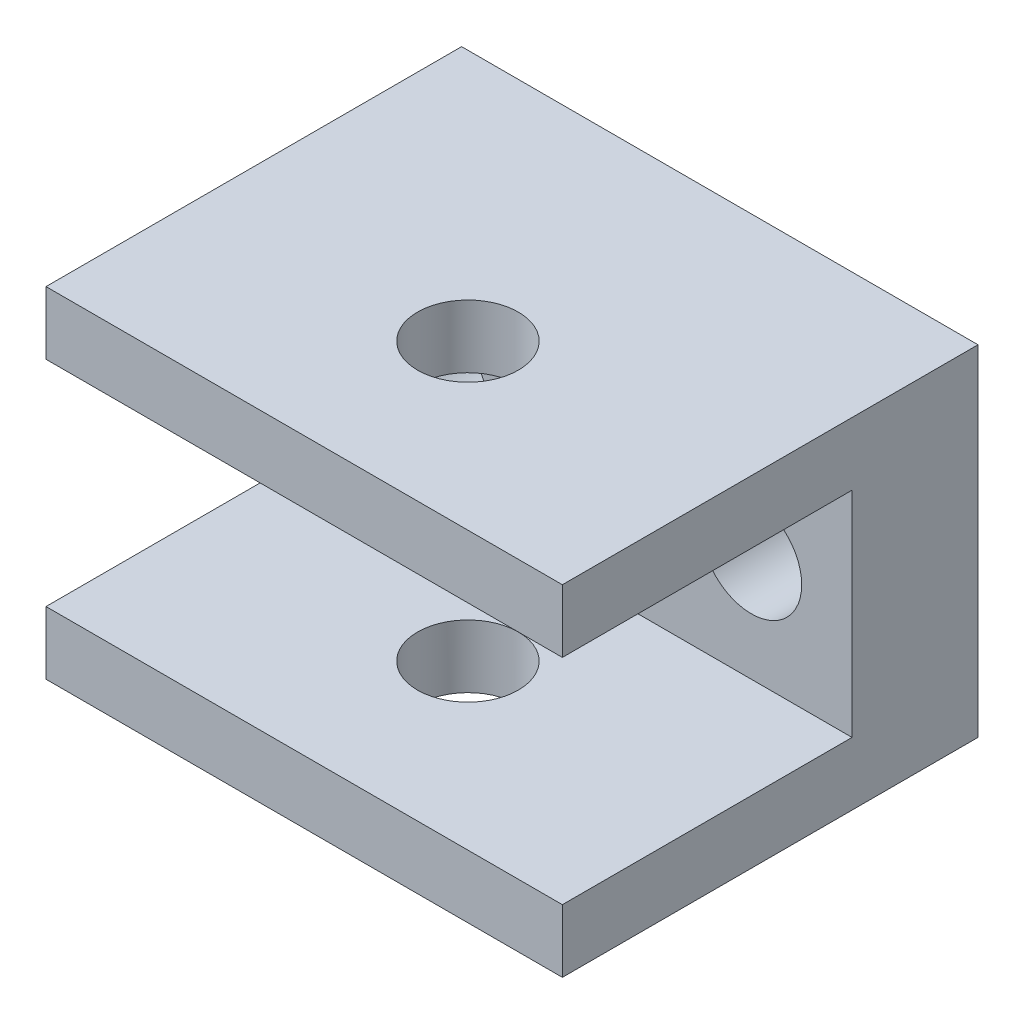
ISO-10303-21;
HEADER;
FILE_DESCRIPTION(('STEP AP214'),'2;1');
FILE_NAME('part.step','',(''),(''),'','','');
FILE_SCHEMA(('AUTOMOTIVE_DESIGN { 1 0 10303 214 1 1 1 1 }'));
ENDSEC;
DATA;
#1=APPLICATION_CONTEXT('core data for automotive mechanical design processes');
#2=APPLICATION_PROTOCOL_DEFINITION('international standard','automotive_design',2000,#1);
#3=PRODUCT_CONTEXT('',#1,'mechanical');
#4=PRODUCT('Part','Part','',(#3));
#5=PRODUCT_RELATED_PRODUCT_CATEGORY('part','',(#4));
#6=PRODUCT_DEFINITION_FORMATION('','',#4);
#7=PRODUCT_DEFINITION_CONTEXT('part definition',#1,'design');
#8=PRODUCT_DEFINITION('design','',#6,#7);
#9=PRODUCT_DEFINITION_SHAPE('','',#8);
#10=(LENGTH_UNIT() NAMED_UNIT(*) SI_UNIT(.MILLI.,.METRE.));
#11=(NAMED_UNIT(*) PLANE_ANGLE_UNIT() SI_UNIT($,.RADIAN.));
#12=(NAMED_UNIT(*) SI_UNIT($,.STERADIAN.) SOLID_ANGLE_UNIT());
#13=UNCERTAINTY_MEASURE_WITH_UNIT(LENGTH_MEASURE(1.E-05),#10,'distance_accuracy_value','');
#14=(GEOMETRIC_REPRESENTATION_CONTEXT(3) GLOBAL_UNCERTAINTY_ASSIGNED_CONTEXT((#13)) GLOBAL_UNIT_ASSIGNED_CONTEXT((#10,
#11,#12)) REPRESENTATION_CONTEXT('',''));
#15=CARTESIAN_POINT('',(0.,0.,0.));
#16=DIRECTION('',(0.,0.,1.));
#17=DIRECTION('',(1.,0.,0.));
#18=AXIS2_PLACEMENT_3D('',#15,#16,#17);
#19=CARTESIAN_POINT('',(0.,201.,-5.));
#20=DIRECTION('',(0.,0.,-1.));
#21=DIRECTION('',(-1.,0.,0.));
#22=AXIS2_PLACEMENT_3D('',#19,#20,#21);
#23=PLANE('',#22);
#24=CARTESIAN_POINT('',(-12.5,201.,-5.));
#25=DIRECTION('',(0.,0.,1.));
#26=DIRECTION('',(1.,0.,0.));
#27=AXIS2_PLACEMENT_3D('',#24,#25,#26);
#28=CIRCLE('',#27,4.);
#29=CARTESIAN_POINT('',(-8.5,201.,-5.));
#30=VERTEX_POINT('',#29);
#31=EDGE_CURVE('E122',#30,#30,#28,.T.);
#32=ORIENTED_EDGE('',*,*,#31,.F.);
#33=EDGE_LOOP('',(#32));
#34=FACE_BOUND('',#33,.T.);
#35=CARTESIAN_POINT('',(12.5,201.,-5.));
#36=DIRECTION('',(0.,0.,1.));
#37=DIRECTION('',(1.,0.,0.));
#38=AXIS2_PLACEMENT_3D('',#35,#36,#37);
#39=CIRCLE('',#38,4.);
#40=CARTESIAN_POINT('',(16.5,201.,-5.));
#41=VERTEX_POINT('',#40);
#42=EDGE_CURVE('E239',#41,#41,#39,.T.);
#43=ORIENTED_EDGE('',*,*,#42,.F.);
#44=EDGE_LOOP('',(#43));
#45=FACE_BOUND('',#44,.T.);
#46=DIRECTION('',(-1.,0.,0.));
#47=VECTOR('',#46,1.);
#48=CARTESIAN_POINT('',(-20.5,192.5,-5.));
#49=LINE('',#48,#47);
#50=CARTESIAN_POINT('',(20.5,192.5,-5.));
#51=VERTEX_POINT('',#50);
#52=CARTESIAN_POINT('',(-20.5,192.5,-5.));
#53=VERTEX_POINT('',#52);
#54=EDGE_CURVE('E120',#51,#53,#49,.T.);
#55=ORIENTED_EDGE('',*,*,#54,.F.);
#56=DIRECTION('',(0.,1.,0.));
#57=VECTOR('',#56,1.);
#58=CARTESIAN_POINT('',(20.5,187.5,-5.));
#59=LINE('',#58,#57);
#60=CARTESIAN_POINT('',(20.5,209.5,-5.));
#61=VERTEX_POINT('',#60);
#62=EDGE_CURVE('E155',#51,#61,#59,.T.);
#63=ORIENTED_EDGE('',*,*,#62,.T.);
#64=DIRECTION('',(1.,0.,0.));
#65=VECTOR('',#64,1.);
#66=CARTESIAN_POINT('',(-20.5,209.5,-5.));
#67=LINE('',#66,#65);
#68=CARTESIAN_POINT('',(-20.5,209.5,-5.));
#69=VERTEX_POINT('',#68);
#70=EDGE_CURVE('E135',#69,#61,#67,.T.);
#71=ORIENTED_EDGE('',*,*,#70,.F.);
#72=DIRECTION('',(0.,1.,0.));
#73=VECTOR('',#72,1.);
#74=CARTESIAN_POINT('',(-20.5,187.5,-5.));
#75=LINE('',#74,#73);
#76=EDGE_CURVE('E53',#53,#69,#75,.T.);
#77=ORIENTED_EDGE('',*,*,#76,.F.);
#78=EDGE_LOOP('',(#55,#63,#71,#77));
#79=FACE_BOUND('',#78,.T.);
#80=ADVANCED_FACE('F36',(#34,#45,#79),#23,.F.);
#81=CARTESIAN_POINT('',(-20.5,187.5,-5.));
#82=DIRECTION('',(-1.,0.,0.));
#83=DIRECTION('',(0.,0.,1.));
#84=AXIS2_PLACEMENT_3D('',#81,#82,#83);
#85=PLANE('',#84);
#86=DIRECTION('',(0.,1.,0.));
#87=VECTOR('',#86,1.);
#88=CARTESIAN_POINT('',(-20.5,187.5,-15.));
#89=LINE('',#88,#87);
#90=CARTESIAN_POINT('',(-20.5,187.5,-15.));
#91=VERTEX_POINT('',#90);
#92=CARTESIAN_POINT('',(-20.5,214.5,-15.));
#93=VERTEX_POINT('',#92);
#94=EDGE_CURVE('E105',#91,#93,#89,.T.);
#95=ORIENTED_EDGE('',*,*,#94,.F.);
#96=DIRECTION('',(0.,0.,-1.));
#97=VECTOR('',#96,1.);
#98=CARTESIAN_POINT('',(-20.5,187.5,-5.));
#99=LINE('',#98,#97);
#100=CARTESIAN_POINT('',(-20.5,187.5,18.));
#101=VERTEX_POINT('',#100);
#102=EDGE_CURVE('E11',#101,#91,#99,.T.);
#103=ORIENTED_EDGE('',*,*,#102,.F.);
#104=DIRECTION('',(0.,-1.,0.));
#105=VECTOR('',#104,1.);
#106=CARTESIAN_POINT('',(-20.5,192.5,18.));
#107=LINE('',#106,#105);
#108=CARTESIAN_POINT('',(-20.5,192.5,18.));
#109=VERTEX_POINT('',#108);
#110=EDGE_CURVE('E103',#109,#101,#107,.T.);
#111=ORIENTED_EDGE('',*,*,#110,.F.);
#112=DIRECTION('',(0.,0.,-1.));
#113=VECTOR('',#112,1.);
#114=CARTESIAN_POINT('',(-20.5,192.5,18.));
#115=LINE('',#114,#113);
#116=EDGE_CURVE('E129',#109,#53,#115,.T.);
#117=ORIENTED_EDGE('',*,*,#116,.T.);
#118=ORIENTED_EDGE('',*,*,#76,.T.);
#119=DIRECTION('',(0.,0.,-1.));
#120=VECTOR('',#119,1.);
#121=CARTESIAN_POINT('',(-20.5,209.5,18.));
#122=LINE('',#121,#120);
#123=CARTESIAN_POINT('',(-20.5,209.5,18.));
#124=VERTEX_POINT('',#123);
#125=EDGE_CURVE('E151',#124,#69,#122,.T.);
#126=ORIENTED_EDGE('',*,*,#125,.F.);
#127=DIRECTION('',(0.,-1.,0.));
#128=VECTOR('',#127,1.);
#129=CARTESIAN_POINT('',(-20.5,209.5,18.));
#130=LINE('',#129,#128);
#131=CARTESIAN_POINT('',(-20.5,214.5,18.));
#132=VERTEX_POINT('',#131);
#133=EDGE_CURVE('E142',#132,#124,#130,.T.);
#134=ORIENTED_EDGE('',*,*,#133,.F.);
#135=DIRECTION('',(0.,0.,-1.));
#136=VECTOR('',#135,1.);
#137=CARTESIAN_POINT('',(-20.5,214.5,-5.));
#138=LINE('',#137,#136);
#139=EDGE_CURVE('E158',#132,#93,#138,.T.);
#140=ORIENTED_EDGE('',*,*,#139,.T.);
#141=EDGE_LOOP('',(#95,#103,#111,#117,#118,#126,#134,#140));
#142=FACE_BOUND('',#141,.T.);
#143=ADVANCED_FACE('F38',(#142),#85,.T.);
#144=CARTESIAN_POINT('',(-20.5,187.5,-5.));
#145=DIRECTION('',(0.,1.,0.));
#146=DIRECTION('',(0.,0.,1.));
#147=AXIS2_PLACEMENT_3D('',#144,#145,#146);
#148=PLANE('',#147);
#149=CARTESIAN_POINT('',(0.,187.5,5.));
#150=DIRECTION('',(0.,1.,0.));
#151=DIRECTION('',(0.,0.,1.));
#152=AXIS2_PLACEMENT_3D('',#149,#150,#151);
#153=CIRCLE('',#152,4.);
#154=CARTESIAN_POINT('',(0.,187.5,9.));
#155=VERTEX_POINT('',#154);
#156=EDGE_CURVE('E227',#155,#155,#153,.F.);
#157=ORIENTED_EDGE('',*,*,#156,.F.);
#158=EDGE_LOOP('',(#157));
#159=FACE_BOUND('',#158,.T.);
#160=DIRECTION('',(1.,0.,0.));
#161=VECTOR('',#160,1.);
#162=CARTESIAN_POINT('',(-20.5,187.5,-15.));
#163=LINE('',#162,#161);
#164=CARTESIAN_POINT('',(20.5,187.5,-15.));
#165=VERTEX_POINT('',#164);
#166=EDGE_CURVE('E156',#91,#165,#163,.T.);
#167=ORIENTED_EDGE('',*,*,#166,.T.);
#168=DIRECTION('',(0.,0.,-1.));
#169=VECTOR('',#168,1.);
#170=CARTESIAN_POINT('',(20.5,187.5,-5.));
#171=LINE('',#170,#169);
#172=CARTESIAN_POINT('',(20.5,187.5,18.));
#173=VERTEX_POINT('',#172);
#174=EDGE_CURVE('E45',#173,#165,#171,.T.);
#175=ORIENTED_EDGE('',*,*,#174,.F.);
#176=DIRECTION('',(1.,0.,0.));
#177=VECTOR('',#176,1.);
#178=CARTESIAN_POINT('',(-20.5,187.5,18.));
#179=LINE('',#178,#177);
#180=EDGE_CURVE('E109',#101,#173,#179,.T.);
#181=ORIENTED_EDGE('',*,*,#180,.F.);
#182=ORIENTED_EDGE('',*,*,#102,.T.);
#183=EDGE_LOOP('',(#167,#175,#181,#182));
#184=FACE_BOUND('',#183,.T.);
#185=ADVANCED_FACE('F110',(#159,#184),#148,.F.);
#186=CARTESIAN_POINT('',(20.5,187.5,-5.));
#187=DIRECTION('',(-1.,0.,0.));
#188=DIRECTION('',(0.,0.,1.));
#189=AXIS2_PLACEMENT_3D('',#186,#187,#188);
#190=PLANE('',#189);
#191=DIRECTION('',(0.,1.,0.));
#192=VECTOR('',#191,1.);
#193=CARTESIAN_POINT('',(20.5,187.5,-15.));
#194=LINE('',#193,#192);
#195=CARTESIAN_POINT('',(20.5,214.5,-15.));
#196=VERTEX_POINT('',#195);
#197=EDGE_CURVE('E163',#165,#196,#194,.T.);
#198=ORIENTED_EDGE('',*,*,#197,.T.);
#199=DIRECTION('',(0.,0.,-1.));
#200=VECTOR('',#199,1.);
#201=CARTESIAN_POINT('',(20.5,214.5,-5.));
#202=LINE('',#201,#200);
#203=CARTESIAN_POINT('',(20.5,214.5,18.));
#204=VERTEX_POINT('',#203);
#205=EDGE_CURVE('E168',#204,#196,#202,.T.);
#206=ORIENTED_EDGE('',*,*,#205,.F.);
#207=DIRECTION('',(0.,1.,0.));
#208=VECTOR('',#207,1.);
#209=CARTESIAN_POINT('',(20.5,209.5,18.));
#210=LINE('',#209,#208);
#211=CARTESIAN_POINT('',(20.5,209.5,18.));
#212=VERTEX_POINT('',#211);
#213=EDGE_CURVE('E136',#212,#204,#210,.T.);
#214=ORIENTED_EDGE('',*,*,#213,.F.);
#215=DIRECTION('',(0.,0.,-1.));
#216=VECTOR('',#215,1.);
#217=CARTESIAN_POINT('',(20.5,209.5,18.));
#218=LINE('',#217,#216);
#219=EDGE_CURVE('E146',#212,#61,#218,.T.);
#220=ORIENTED_EDGE('',*,*,#219,.T.);
#221=ORIENTED_EDGE('',*,*,#62,.F.);
#222=DIRECTION('',(0.,0.,-1.));
#223=VECTOR('',#222,1.);
#224=CARTESIAN_POINT('',(20.5,192.5,18.));
#225=LINE('',#224,#223);
#226=CARTESIAN_POINT('',(20.5,192.5,18.));
#227=VERTEX_POINT('',#226);
#228=EDGE_CURVE('E132',#227,#51,#225,.T.);
#229=ORIENTED_EDGE('',*,*,#228,.F.);
#230=DIRECTION('',(0.,1.,0.));
#231=VECTOR('',#230,1.);
#232=CARTESIAN_POINT('',(20.5,192.5,18.));
#233=LINE('',#232,#231);
#234=EDGE_CURVE('E114',#173,#227,#233,.T.);
#235=ORIENTED_EDGE('',*,*,#234,.F.);
#236=ORIENTED_EDGE('',*,*,#174,.T.);
#237=EDGE_LOOP('',(#198,#206,#214,#220,#221,#229,#235,#236));
#238=FACE_BOUND('',#237,.T.);
#239=ADVANCED_FACE('F178',(#238),#190,.F.);
#240=CARTESIAN_POINT('',(-20.5,214.5,-5.));
#241=DIRECTION('',(0.,1.,0.));
#242=DIRECTION('',(0.,0.,1.));
#243=AXIS2_PLACEMENT_3D('',#240,#241,#242);
#244=PLANE('',#243);
#245=CARTESIAN_POINT('',(0.,214.5,5.));
#246=DIRECTION('',(0.,1.,0.));
#247=DIRECTION('',(0.,0.,1.));
#248=AXIS2_PLACEMENT_3D('',#245,#246,#247);
#249=CIRCLE('',#248,4.);
#250=CARTESIAN_POINT('',(0.,214.5,9.));
#251=VERTEX_POINT('',#250);
#252=EDGE_CURVE('E225',#251,#251,#249,.T.);
#253=ORIENTED_EDGE('',*,*,#252,.F.);
#254=EDGE_LOOP('',(#253));
#255=FACE_BOUND('',#254,.T.);
#256=DIRECTION('',(1.,0.,0.));
#257=VECTOR('',#256,1.);
#258=CARTESIAN_POINT('',(-20.5,214.5,-15.));
#259=LINE('',#258,#257);
#260=EDGE_CURVE('E160',#93,#196,#259,.T.);
#261=ORIENTED_EDGE('',*,*,#260,.F.);
#262=ORIENTED_EDGE('',*,*,#139,.F.);
#263=DIRECTION('',(-1.,0.,0.));
#264=VECTOR('',#263,1.);
#265=CARTESIAN_POINT('',(-20.5,214.5,18.));
#266=LINE('',#265,#264);
#267=EDGE_CURVE('E139',#204,#132,#266,.T.);
#268=ORIENTED_EDGE('',*,*,#267,.F.);
#269=ORIENTED_EDGE('',*,*,#205,.T.);
#270=EDGE_LOOP('',(#261,#262,#268,#269));
#271=FACE_BOUND('',#270,.T.);
#272=ADVANCED_FACE('F173',(#255,#271),#244,.T.);
#273=CARTESIAN_POINT('',(0.,201.,-15.));
#274=DIRECTION('',(0.,0.,-1.));
#275=DIRECTION('',(-1.,0.,0.));
#276=AXIS2_PLACEMENT_3D('',#273,#274,#275);
#277=PLANE('',#276);
#278=CARTESIAN_POINT('',(-12.5,201.,-15.));
#279=DIRECTION('',(0.,0.,-1.));
#280=DIRECTION('',(-1.,0.,0.));
#281=AXIS2_PLACEMENT_3D('',#278,#279,#280);
#282=CIRCLE('',#281,4.);
#283=CARTESIAN_POINT('',(-16.5,201.,-15.));
#284=VERTEX_POINT('',#283);
#285=EDGE_CURVE('E237',#284,#284,#282,.F.);
#286=ORIENTED_EDGE('',*,*,#285,.T.);
#287=EDGE_LOOP('',(#286));
#288=FACE_BOUND('',#287,.T.);
#289=CARTESIAN_POINT('',(12.5,201.,-15.));
#290=DIRECTION('',(0.,0.,-1.));
#291=DIRECTION('',(-1.,0.,0.));
#292=AXIS2_PLACEMENT_3D('',#289,#290,#291);
#293=CIRCLE('',#292,4.);
#294=CARTESIAN_POINT('',(8.5,201.,-15.));
#295=VERTEX_POINT('',#294);
#296=EDGE_CURVE('E125',#295,#295,#293,.F.);
#297=ORIENTED_EDGE('',*,*,#296,.T.);
#298=EDGE_LOOP('',(#297));
#299=FACE_BOUND('',#298,.T.);
#300=ORIENTED_EDGE('',*,*,#94,.T.);
#301=ORIENTED_EDGE('',*,*,#260,.T.);
#302=ORIENTED_EDGE('',*,*,#197,.F.);
#303=ORIENTED_EDGE('',*,*,#166,.F.);
#304=EDGE_LOOP('',(#300,#301,#302,#303));
#305=FACE_BOUND('',#304,.T.);
#306=ADVANCED_FACE('F176',(#288,#299,#305),#277,.T.);
#307=CARTESIAN_POINT('',(-20.5,209.5,18.));
#308=DIRECTION('',(0.,1.,0.));
#309=DIRECTION('',(0.,0.,1.));
#310=AXIS2_PLACEMENT_3D('',#307,#308,#309);
#311=PLANE('',#310);
#312=CARTESIAN_POINT('',(0.,209.5,5.));
#313=DIRECTION('',(0.,1.,0.));
#314=DIRECTION('',(0.,0.,1.));
#315=AXIS2_PLACEMENT_3D('',#312,#313,#314);
#316=CIRCLE('',#315,4.);
#317=CARTESIAN_POINT('',(0.,209.5,9.));
#318=VERTEX_POINT('',#317);
#319=EDGE_CURVE('E232',#318,#318,#316,.T.);
#320=ORIENTED_EDGE('',*,*,#319,.T.);
#321=EDGE_LOOP('',(#320));
#322=FACE_BOUND('',#321,.T.);
#323=ORIENTED_EDGE('',*,*,#70,.T.);
#324=ORIENTED_EDGE('',*,*,#219,.F.);
#325=DIRECTION('',(1.,0.,0.));
#326=VECTOR('',#325,1.);
#327=CARTESIAN_POINT('',(-20.5,209.5,18.));
#328=LINE('',#327,#326);
#329=EDGE_CURVE('E144',#124,#212,#328,.T.);
#330=ORIENTED_EDGE('',*,*,#329,.F.);
#331=ORIENTED_EDGE('',*,*,#125,.T.);
#332=EDGE_LOOP('',(#323,#324,#330,#331));
#333=FACE_BOUND('',#332,.T.);
#334=ADVANCED_FACE('F184',(#322,#333),#311,.F.);
#335=CARTESIAN_POINT('',(0.,201.,18.));
#336=DIRECTION('',(0.,0.,-1.));
#337=DIRECTION('',(-1.,0.,0.));
#338=AXIS2_PLACEMENT_3D('',#335,#336,#337);
#339=PLANE('',#338);
#340=ORIENTED_EDGE('',*,*,#213,.T.);
#341=ORIENTED_EDGE('',*,*,#267,.T.);
#342=ORIENTED_EDGE('',*,*,#133,.T.);
#343=ORIENTED_EDGE('',*,*,#329,.T.);
#344=EDGE_LOOP('',(#340,#341,#342,#343));
#345=FACE_BOUND('',#344,.T.);
#346=ADVANCED_FACE('F188',(#345),#339,.F.);
#347=CARTESIAN_POINT('',(-20.5,192.5,18.));
#348=DIRECTION('',(0.,-1.,0.));
#349=DIRECTION('',(0.,0.,-1.));
#350=AXIS2_PLACEMENT_3D('',#347,#348,#349);
#351=PLANE('',#350);
#352=CARTESIAN_POINT('',(0.,192.5,5.));
#353=DIRECTION('',(0.,-1.,0.));
#354=DIRECTION('',(0.,0.,-1.));
#355=AXIS2_PLACEMENT_3D('',#352,#353,#354);
#356=CIRCLE('',#355,4.);
#357=CARTESIAN_POINT('',(0.,192.5,1.));
#358=VERTEX_POINT('',#357);
#359=EDGE_CURVE('E40',#358,#358,#356,.T.);
#360=ORIENTED_EDGE('',*,*,#359,.T.);
#361=EDGE_LOOP('',(#360));
#362=FACE_BOUND('',#361,.T.);
#363=ORIENTED_EDGE('',*,*,#54,.T.);
#364=ORIENTED_EDGE('',*,*,#116,.F.);
#365=DIRECTION('',(-1.,0.,0.));
#366=VECTOR('',#365,1.);
#367=CARTESIAN_POINT('',(-20.5,192.5,18.));
#368=LINE('',#367,#366);
#369=EDGE_CURVE('E118',#227,#109,#368,.T.);
#370=ORIENTED_EDGE('',*,*,#369,.F.);
#371=ORIENTED_EDGE('',*,*,#228,.T.);
#372=EDGE_LOOP('',(#363,#364,#370,#371));
#373=FACE_BOUND('',#372,.T.);
#374=ADVANCED_FACE('F181',(#362,#373),#351,.F.);
#375=CARTESIAN_POINT('',(0.,201.,18.));
#376=DIRECTION('',(0.,0.,1.));
#377=DIRECTION('',(1.,0.,0.));
#378=AXIS2_PLACEMENT_3D('',#375,#376,#377);
#379=PLANE('',#378);
#380=ORIENTED_EDGE('',*,*,#110,.T.);
#381=ORIENTED_EDGE('',*,*,#180,.T.);
#382=ORIENTED_EDGE('',*,*,#234,.T.);
#383=ORIENTED_EDGE('',*,*,#369,.T.);
#384=EDGE_LOOP('',(#380,#381,#382,#383));
#385=FACE_BOUND('',#384,.T.);
#386=ADVANCED_FACE('F116',(#385),#379,.T.);
#387=CARTESIAN_POINT('',(12.5,201.,-15.001));
#388=DIRECTION('',(0.,0.,1.));
#389=DIRECTION('',(1.,0.,0.));
#390=AXIS2_PLACEMENT_3D('',#387,#388,#389);
#391=CYLINDRICAL_SURFACE('',#390,4.);
#392=ORIENTED_EDGE('',*,*,#296,.F.);
#393=EDGE_LOOP('',(#392));
#394=FACE_BOUND('',#393,.T.);
#395=ORIENTED_EDGE('',*,*,#42,.T.);
#396=EDGE_LOOP('',(#395));
#397=FACE_BOUND('',#396,.T.);
#398=ADVANCED_FACE('F247',(#394,#397),#391,.F.);
#399=CARTESIAN_POINT('',(-12.5,201.,-15.001));
#400=DIRECTION('',(0.,0.,1.));
#401=DIRECTION('',(1.,0.,0.));
#402=AXIS2_PLACEMENT_3D('',#399,#400,#401);
#403=CYLINDRICAL_SURFACE('',#402,4.);
#404=ORIENTED_EDGE('',*,*,#285,.F.);
#405=EDGE_LOOP('',(#404));
#406=FACE_BOUND('',#405,.T.);
#407=ORIENTED_EDGE('',*,*,#31,.T.);
#408=EDGE_LOOP('',(#407));
#409=FACE_BOUND('',#408,.T.);
#410=ADVANCED_FACE('F249',(#406,#409),#403,.F.);
#411=CARTESIAN_POINT('',(0.,176.186291501015,5.));
#412=DIRECTION('',(0.,1.,0.));
#413=DIRECTION('',(0.,0.,1.));
#414=AXIS2_PLACEMENT_3D('',#411,#412,#413);
#415=CYLINDRICAL_SURFACE('',#414,4.);
#416=ORIENTED_EDGE('',*,*,#156,.T.);
#417=EDGE_LOOP('',(#416));
#418=FACE_BOUND('',#417,.T.);
#419=ORIENTED_EDGE('',*,*,#359,.F.);
#420=EDGE_LOOP('',(#419));
#421=FACE_BOUND('',#420,.T.);
#422=ADVANCED_FACE('F256',(#418,#421),#415,.F.);
#423=ORIENTED_EDGE('',*,*,#252,.T.);
#424=EDGE_LOOP('',(#423));
#425=FACE_BOUND('',#424,.T.);
#426=ORIENTED_EDGE('',*,*,#319,.F.);
#427=EDGE_LOOP('',(#426));
#428=FACE_BOUND('',#427,.T.);
#429=ADVANCED_FACE('F261',(#425,#428),#415,.F.);
#430=CLOSED_SHELL('',(#80,#143,#185,#239,#272,#306,#334,#346,#374,#386,#398,#410,#422,#429));
#431=MANIFOLD_SOLID_BREP('B2',#430);
#432=ADVANCED_BREP_SHAPE_REPRESENTATION('',(#18,#431),#14);
#433=SHAPE_DEFINITION_REPRESENTATION(#9,#432);
ENDSEC;
END-ISO-10303-21;
